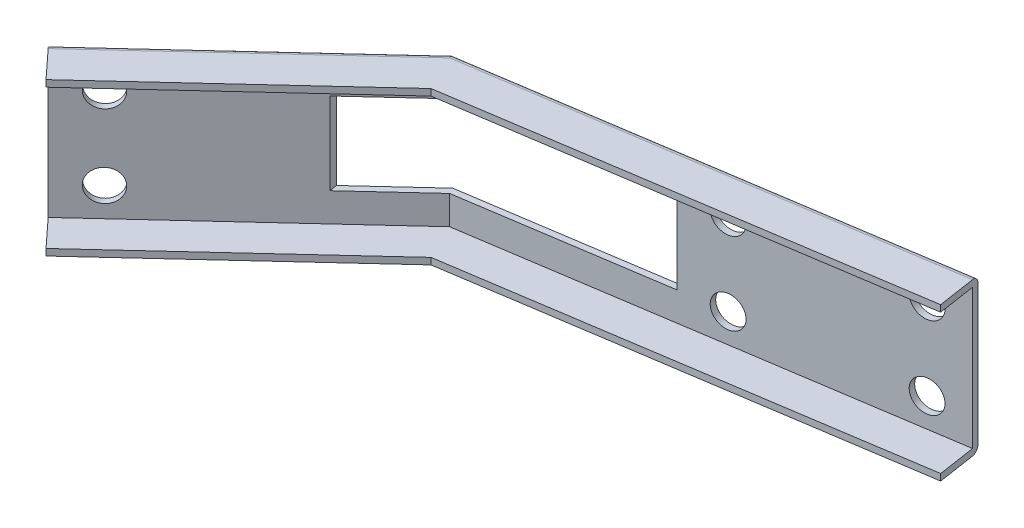
ISO-10303-21;
HEADER;
FILE_DESCRIPTION(('STEP AP214'),'2;1');
FILE_NAME('part.step','',(''),(''),'','','');
FILE_SCHEMA(('AUTOMOTIVE_DESIGN { 1 0 10303 214 1 1 1 1 }'));
ENDSEC;
DATA;
#1=APPLICATION_CONTEXT('core data for automotive mechanical design processes');
#2=APPLICATION_PROTOCOL_DEFINITION('international standard','automotive_design',2000,#1);
#3=PRODUCT_CONTEXT('',#1,'mechanical');
#4=PRODUCT('Part','Part','',(#3));
#5=PRODUCT_RELATED_PRODUCT_CATEGORY('part','',(#4));
#6=PRODUCT_DEFINITION_FORMATION('','',#4);
#7=PRODUCT_DEFINITION_CONTEXT('part definition',#1,'design');
#8=PRODUCT_DEFINITION('design','',#6,#7);
#9=PRODUCT_DEFINITION_SHAPE('','',#8);
#10=(LENGTH_UNIT() NAMED_UNIT(*) SI_UNIT(.MILLI.,.METRE.));
#11=(NAMED_UNIT(*) PLANE_ANGLE_UNIT() SI_UNIT($,.RADIAN.));
#12=(NAMED_UNIT(*) SI_UNIT($,.STERADIAN.) SOLID_ANGLE_UNIT());
#13=UNCERTAINTY_MEASURE_WITH_UNIT(LENGTH_MEASURE(1.E-05),#10,'distance_accuracy_value','');
#14=(GEOMETRIC_REPRESENTATION_CONTEXT(3) GLOBAL_UNCERTAINTY_ASSIGNED_CONTEXT((#13)) GLOBAL_UNIT_ASSIGNED_CONTEXT((#10,
#11,#12)) REPRESENTATION_CONTEXT('',''));
#15=CARTESIAN_POINT('',(0.,0.,0.));
#16=DIRECTION('',(0.,0.,1.));
#17=DIRECTION('',(1.,0.,0.));
#18=AXIS2_PLACEMENT_3D('',#15,#16,#17);
#19=CARTESIAN_POINT('',(83.2680733172753,26.64,-21.8416647390503));
#20=DIRECTION('',(0.1512877167966,0.,0.98848977068378));
#21=DIRECTION('',(0.98848977068378,0.,-0.1512877167966));
#22=AXIS2_PLACEMENT_3D('',#19,#20,#21);
#23=PLANE('',#22);
#24=CARTESIAN_POINT('',(76.9911632734333,5.5,-20.8809877373919));
#25=DIRECTION('',(-0.1512877167966,0.,-0.98848977068378));
#26=DIRECTION('',(-0.98848977068378,0.,0.1512877167966));
#27=AXIS2_PLACEMENT_3D('',#24,#25,#26);
#28=CIRCLE('',#27,3.00000000000001);
#29=CARTESIAN_POINT('',(74.025693961382,5.5,-20.4271245870021));
#30=VERTEX_POINT('',#29);
#31=EDGE_CURVE('E293',#30,#30,#28,.T.);
#32=ORIENTED_EDGE('',*,*,#31,.F.);
#33=EDGE_LOOP('',(#32));
#34=FACE_BOUND('',#33,.T.);
#35=CARTESIAN_POINT('',(44.0744539096634,5.5,-15.8431067680651));
#36=DIRECTION('',(-0.1512877167966,0.,-0.98848977068378));
#37=DIRECTION('',(-0.98848977068378,0.,0.1512877167966));
#38=AXIS2_PLACEMENT_3D('',#35,#36,#37);
#39=CIRCLE('',#38,3.);
#40=CARTESIAN_POINT('',(41.1089845976121,5.5,-15.3892436176753));
#41=VERTEX_POINT('',#40);
#42=EDGE_CURVE('E304',#41,#41,#39,.T.);
#43=ORIENTED_EDGE('',*,*,#42,.F.);
#44=EDGE_LOOP('',(#43));
#45=FACE_BOUND('',#44,.T.);
#46=CARTESIAN_POINT('',(44.0744539096634,21.14,-15.8431067680651));
#47=DIRECTION('',(-0.1512877167966,0.,-0.98848977068378));
#48=DIRECTION('',(-0.98848977068378,0.,0.1512877167966));
#49=AXIS2_PLACEMENT_3D('',#46,#47,#48);
#50=CIRCLE('',#49,3.);
#51=CARTESIAN_POINT('',(41.1089845976121,21.14,-15.3892436176753));
#52=VERTEX_POINT('',#51);
#53=EDGE_CURVE('E298',#52,#52,#50,.T.);
#54=ORIENTED_EDGE('',*,*,#53,.F.);
#55=EDGE_LOOP('',(#54));
#56=FACE_BOUND('',#55,.T.);
#57=CARTESIAN_POINT('',(76.9911632734333,21.14,-20.8809877373919));
#58=DIRECTION('',(-0.1512877167966,0.,-0.98848977068378));
#59=DIRECTION('',(-0.98848977068378,0.,0.1512877167966));
#60=AXIS2_PLACEMENT_3D('',#57,#58,#59);
#61=CIRCLE('',#60,3.00000000000001);
#62=CARTESIAN_POINT('',(74.025693961382,21.14,-20.4271245870021));
#63=VERTEX_POINT('',#62);
#64=EDGE_CURVE('E297',#63,#63,#61,.T.);
#65=ORIENTED_EDGE('',*,*,#64,.F.);
#66=EDGE_LOOP('',(#65));
#67=FACE_BOUND('',#66,.T.);
#68=DIRECTION('',(0.,-1.,0.));
#69=VECTOR('',#68,1.);
#70=CARTESIAN_POINT('',(-2.38309792909385,26.64,-8.73280866069736));
#71=LINE('',#70,#69);
#72=CARTESIAN_POINT('',(-2.38309792909385,5.5,-8.73280866069736));
#73=VERTEX_POINT('',#72);
#74=CARTESIAN_POINT('',(-2.38309792909385,0.,-8.73280866069736));
#75=VERTEX_POINT('',#74);
#76=EDGE_CURVE('E355',#73,#75,#71,.T.);
#77=ORIENTED_EDGE('',*,*,#76,.F.);
#78=DIRECTION('',(-0.98848977068378,0.,0.1512877167966));
#79=VECTOR('',#78,1.);
#80=CARTESIAN_POINT('',(35.6028924268988,5.5,-14.5465397903988));
#81=LINE('',#80,#79);
#82=CARTESIAN_POINT('',(35.6028924268988,5.5,-14.5465397903988));
#83=VERTEX_POINT('',#82);
#84=EDGE_CURVE('E199',#83,#73,#81,.T.);
#85=ORIENTED_EDGE('',*,*,#84,.F.);
#86=DIRECTION('',(0.,-1.,0.));
#87=VECTOR('',#86,1.);
#88=CARTESIAN_POINT('',(35.6028924268988,21.14,-14.5465397903988));
#89=LINE('',#88,#87);
#90=CARTESIAN_POINT('',(35.6028924268988,21.14,-14.5465397903988));
#91=VERTEX_POINT('',#90);
#92=EDGE_CURVE('E182',#91,#83,#89,.T.);
#93=ORIENTED_EDGE('',*,*,#92,.F.);
#94=DIRECTION('',(0.98848977068378,0.,-0.1512877167966));
#95=VECTOR('',#94,1.);
#96=CARTESIAN_POINT('',(35.6028924268988,21.14,-14.5465397903988));
#97=LINE('',#96,#95);
#98=CARTESIAN_POINT('',(-2.38309792909385,21.14,-8.73280866069736));
#99=VERTEX_POINT('',#98);
#100=EDGE_CURVE('E190',#99,#91,#97,.T.);
#101=ORIENTED_EDGE('',*,*,#100,.F.);
#102=CARTESIAN_POINT('',(-2.38309792909385,26.64,-8.73280866069736));
#103=VERTEX_POINT('',#102);
#104=EDGE_CURVE('E356',#103,#99,#71,.T.);
#105=ORIENTED_EDGE('',*,*,#104,.F.);
#106=DIRECTION('',(-0.98848977068378,0.,0.1512877167966));
#107=VECTOR('',#106,1.);
#108=CARTESIAN_POINT('',(83.2680733172753,26.64,-21.8416647390503));
#109=LINE('',#108,#107);
#110=CARTESIAN_POINT('',(84.5036855306301,26.64,-22.030774385046));
#111=VERTEX_POINT('',#110);
#112=EDGE_CURVE('E362',#103,#111,#109,.F.);
#113=ORIENTED_EDGE('',*,*,#112,.T.);
#114=DIRECTION('',(0.,1.,0.));
#115=VECTOR('',#114,1.);
#116=CARTESIAN_POINT('',(84.5036855306301,0.,-22.030774385046));
#117=LINE('',#116,#115);
#118=CARTESIAN_POINT('',(84.5036855306301,0.,-22.030774385046));
#119=VERTEX_POINT('',#118);
#120=EDGE_CURVE('E272',#119,#111,#117,.T.);
#121=ORIENTED_EDGE('',*,*,#120,.F.);
#122=DIRECTION('',(0.98848977068378,0.,-0.1512877167966));
#123=VECTOR('',#122,1.);
#124=CARTESIAN_POINT('',(-2.38309792909385,0.,-8.73280866069736));
#125=LINE('',#124,#123);
#126=EDGE_CURVE('E364',#119,#75,#125,.F.);
#127=ORIENTED_EDGE('',*,*,#126,.T.);
#128=EDGE_LOOP('',(#77,#85,#93,#101,#105,#113,#121,#127));
#129=FACE_BOUND('',#128,.T.);
#130=ADVANCED_FACE('F38',(#34,#45,#56,#67,#129),#23,.F.);
#131=CARTESIAN_POINT('',(-41.5646788234609,26.64,27.4248875475564));
#132=DIRECTION('',(0.678179666410242,0.,0.734896142368222));
#133=DIRECTION('',(0.734896142368222,0.,-0.678179666410242));
#134=AXIS2_PLACEMENT_3D('',#131,#132,#133);
#135=PLANE('',#134);
#136=CARTESIAN_POINT('',(-36.8980883194227,5.5,23.1184466658513));
#137=DIRECTION('',(-0.678179666410242,0.,-0.734896142368222));
#138=DIRECTION('',(-0.734896142368222,0.,0.678179666410242));
#139=AXIS2_PLACEMENT_3D('',#136,#137,#138);
#140=CIRCLE('',#139,3.);
#141=CARTESIAN_POINT('',(-39.1027767465273,5.5,25.152985665082));
#142=VERTEX_POINT('',#141);
#143=EDGE_CURVE('E256',#142,#142,#140,.T.);
#144=ORIENTED_EDGE('',*,*,#143,.F.);
#145=EDGE_LOOP('',(#144));
#146=FACE_BOUND('',#145,.T.);
#147=CARTESIAN_POINT('',(-36.8980883194227,21.14,23.1184466658513));
#148=DIRECTION('',(-0.678179666410242,0.,-0.734896142368222));
#149=DIRECTION('',(-0.734896142368222,0.,0.678179666410242));
#150=AXIS2_PLACEMENT_3D('',#147,#148,#149);
#151=CIRCLE('',#150,3.00000000000001);
#152=CARTESIAN_POINT('',(-39.1027767465273,21.14,25.1529856650821));
#153=VERTEX_POINT('',#152);
#154=EDGE_CURVE('E251',#153,#153,#151,.T.);
#155=ORIENTED_EDGE('',*,*,#154,.F.);
#156=EDGE_LOOP('',(#155));
#157=FACE_BOUND('',#156,.T.);
#158=DIRECTION('',(0.,-1.,0.));
#159=VECTOR('',#158,1.);
#160=CARTESIAN_POINT('',(-13.9180157054169,26.64,1.91188824083665));
#161=LINE('',#160,#159);
#162=CARTESIAN_POINT('',(-13.9180157054169,21.14,1.91188824083666));
#163=VERTEX_POINT('',#162);
#164=CARTESIAN_POINT('',(-13.9180157054169,5.5,1.91188824083666));
#165=VERTEX_POINT('',#164);
#166=EDGE_CURVE('E218',#163,#165,#161,.T.);
#167=ORIENTED_EDGE('',*,*,#166,.T.);
#168=DIRECTION('',(0.734896142368222,0.,-0.678179666410242));
#169=VECTOR('',#168,1.);
#170=CARTESIAN_POINT('',(-41.5646788234609,5.5,27.4248875475564));
#171=LINE('',#170,#169);
#172=EDGE_CURVE('E215',#165,#73,#171,.T.);
#173=ORIENTED_EDGE('',*,*,#172,.T.);
#174=ORIENTED_EDGE('',*,*,#76,.T.);
#175=DIRECTION('',(0.734896142368222,0.,-0.678179666410242));
#176=VECTOR('',#175,1.);
#177=CARTESIAN_POINT('',(-41.5646788234609,0.,27.4248875475564));
#178=LINE('',#177,#176);
#179=CARTESIAN_POINT('',(-42.4832990014212,0.,28.2726121305692));
#180=VERTEX_POINT('',#179);
#181=EDGE_CURVE('E369',#75,#180,#178,.F.);
#182=ORIENTED_EDGE('',*,*,#181,.T.);
#183=DIRECTION('',(0.,-1.,0.));
#184=VECTOR('',#183,1.);
#185=CARTESIAN_POINT('',(-42.4832990014212,26.64,28.2726121305692));
#186=LINE('',#185,#184);
#187=CARTESIAN_POINT('',(-42.4832990014212,26.64,28.2726121305692));
#188=VERTEX_POINT('',#187);
#189=EDGE_CURVE('E224',#188,#180,#186,.T.);
#190=ORIENTED_EDGE('',*,*,#189,.F.);
#191=DIRECTION('',(-0.734896142368222,0.,0.678179666410242));
#192=VECTOR('',#191,1.);
#193=CARTESIAN_POINT('',(-2.38309792909385,26.64,-8.73280866069735));
#194=LINE('',#193,#192);
#195=EDGE_CURVE('E367',#188,#103,#194,.F.);
#196=ORIENTED_EDGE('',*,*,#195,.T.);
#197=ORIENTED_EDGE('',*,*,#104,.T.);
#198=DIRECTION('',(-0.734896142368222,0.,0.678179666410242));
#199=VECTOR('',#198,1.);
#200=CARTESIAN_POINT('',(-41.5646788234609,21.14,27.4248875475564));
#201=LINE('',#200,#199);
#202=EDGE_CURVE('E193',#99,#163,#201,.T.);
#203=ORIENTED_EDGE('',*,*,#202,.T.);
#204=EDGE_LOOP('',(#167,#173,#174,#182,#190,#196,#197,#203));
#205=FACE_BOUND('',#204,.T.);
#206=ADVANCED_FACE('F425',(#146,#157,#205),#135,.F.);
#207=CARTESIAN_POINT('',(-40.7169542404481,26.64,28.3435077255166));
#208=DIRECTION('',(-0.678179666410242,0.,-0.734896142368222));
#209=DIRECTION('',(-0.734896142368222,0.,0.678179666410242));
#210=AXIS2_PLACEMENT_3D('',#207,#208,#209);
#211=PLANE('',#210);
#212=CARTESIAN_POINT('',(-36.0503637364099,5.5,24.0370668438116));
#213=DIRECTION('',(-0.678179666410242,0.,-0.734896142368222));
#214=DIRECTION('',(-0.734896142368222,0.,0.678179666410242));
#215=AXIS2_PLACEMENT_3D('',#212,#213,#214);
#216=CIRCLE('',#215,3.);
#217=CARTESIAN_POINT('',(-38.2550521635145,5.5,26.0716058430423));
#218=VERTEX_POINT('',#217);
#219=EDGE_CURVE('E252',#218,#218,#216,.T.);
#220=ORIENTED_EDGE('',*,*,#219,.T.);
#221=EDGE_LOOP('',(#220));
#222=FACE_BOUND('',#221,.T.);
#223=CARTESIAN_POINT('',(-36.0503637364099,21.14,24.0370668438116));
#224=DIRECTION('',(-0.678179666410242,0.,-0.734896142368222));
#225=DIRECTION('',(-0.734896142368222,0.,0.678179666410242));
#226=AXIS2_PLACEMENT_3D('',#223,#224,#225);
#227=CIRCLE('',#226,3.00000000000001);
#228=CARTESIAN_POINT('',(-38.2550521635145,21.14,26.0716058430423));
#229=VERTEX_POINT('',#228);
#230=EDGE_CURVE('E259',#229,#229,#227,.T.);
#231=ORIENTED_EDGE('',*,*,#230,.T.);
#232=EDGE_LOOP('',(#231));
#233=FACE_BOUND('',#232,.T.);
#234=DIRECTION('',(0.,-1.,0.));
#235=VECTOR('',#234,1.);
#236=CARTESIAN_POINT('',(-1.81622371909089,26.64,-7.55501306828298));
#237=LINE('',#236,#235);
#238=CARTESIAN_POINT('',(-1.8162237190909,5.5,-7.55501306828298));
#239=VERTEX_POINT('',#238);
#240=CARTESIAN_POINT('',(-1.81622371909089,0.,-7.55501306828298));
#241=VERTEX_POINT('',#240);
#242=EDGE_CURVE('E348',#239,#241,#237,.T.);
#243=ORIENTED_EDGE('',*,*,#242,.F.);
#244=DIRECTION('',(-0.734896142368222,0.,0.678179666410242));
#245=VECTOR('',#244,1.);
#246=CARTESIAN_POINT('',(-40.7169542404481,5.5,28.3435077255166));
#247=LINE('',#246,#245);
#248=CARTESIAN_POINT('',(-13.6899082561816,5.5,3.40230586997574));
#249=VERTEX_POINT('',#248);
#250=EDGE_CURVE('E212',#239,#249,#247,.T.);
#251=ORIENTED_EDGE('',*,*,#250,.T.);
#252=DIRECTION('',(0.,1.,0.));
#253=VECTOR('',#252,1.);
#254=CARTESIAN_POINT('',(-13.6899082561816,26.64,3.40230586997575));
#255=LINE('',#254,#253);
#256=CARTESIAN_POINT('',(-13.6899082561816,21.14,3.40230586997574));
#257=VERTEX_POINT('',#256);
#258=EDGE_CURVE('E11',#249,#257,#255,.T.);
#259=ORIENTED_EDGE('',*,*,#258,.T.);
#260=DIRECTION('',(0.734896142368222,0.,-0.678179666410242));
#261=VECTOR('',#260,1.);
#262=CARTESIAN_POINT('',(-40.7169542404481,21.14,28.3435077255166));
#263=LINE('',#262,#261);
#264=CARTESIAN_POINT('',(-1.8162237190909,21.14,-7.55501306828298));
#265=VERTEX_POINT('',#264);
#266=EDGE_CURVE('E206',#257,#265,#263,.T.);
#267=ORIENTED_EDGE('',*,*,#266,.T.);
#268=CARTESIAN_POINT('',(-1.81622371909089,26.64,-7.55501306828298));
#269=VERTEX_POINT('',#268);
#270=EDGE_CURVE('E352',#269,#265,#237,.T.);
#271=ORIENTED_EDGE('',*,*,#270,.F.);
#272=DIRECTION('',(0.734896142368221,0.,-0.678179666410242));
#273=VECTOR('',#272,1.);
#274=CARTESIAN_POINT('',(-40.7169542404481,26.64,28.3435077255166));
#275=LINE('',#274,#273);
#276=CARTESIAN_POINT('',(-41.6355744184084,26.64,29.1912323085294));
#277=VERTEX_POINT('',#276);
#278=EDGE_CURVE('E342',#277,#269,#275,.T.);
#279=ORIENTED_EDGE('',*,*,#278,.F.);
#280=DIRECTION('',(0.,1.,0.));
#281=VECTOR('',#280,1.);
#282=CARTESIAN_POINT('',(-41.6355744184084,0.,29.1912323085294));
#283=LINE('',#282,#281);
#284=CARTESIAN_POINT('',(-41.6355744184084,0.,29.1912323085294));
#285=VERTEX_POINT('',#284);
#286=EDGE_CURVE('E239',#285,#277,#283,.T.);
#287=ORIENTED_EDGE('',*,*,#286,.F.);
#288=DIRECTION('',(0.734896142368221,0.,-0.678179666410242));
#289=VECTOR('',#288,1.);
#290=CARTESIAN_POINT('',(-40.7169542404481,0.,28.3435077255166));
#291=LINE('',#290,#289);
#292=EDGE_CURVE('E341',#285,#241,#291,.T.);
#293=ORIENTED_EDGE('',*,*,#292,.T.);
#294=EDGE_LOOP('',(#243,#251,#259,#267,#271,#279,#287,#293));
#295=FACE_BOUND('',#294,.T.);
#296=ADVANCED_FACE('F388',(#222,#233,#295),#211,.F.);
#297=CARTESIAN_POINT('',(83.4571829632711,26.64,-20.6060525256953));
#298=DIRECTION('',(-0.1512877167966,0.,-0.98848977068378));
#299=DIRECTION('',(-0.98848977068378,0.,0.1512877167966));
#300=AXIS2_PLACEMENT_3D('',#297,#298,#299);
#301=PLANE('',#300);
#302=CARTESIAN_POINT('',(77.1802729194291,5.5,-19.6453755240371));
#303=DIRECTION('',(-0.1512877167966,0.,-0.98848977068378));
#304=DIRECTION('',(-0.98848977068378,0.,0.1512877167966));
#305=AXIS2_PLACEMENT_3D('',#302,#303,#304);
#306=CIRCLE('',#305,3.00000000000001);
#307=CARTESIAN_POINT('',(74.2148036073777,5.5,-19.1915123736473));
#308=VERTEX_POINT('',#307);
#309=EDGE_CURVE('E307',#308,#308,#306,.T.);
#310=ORIENTED_EDGE('',*,*,#309,.T.);
#311=EDGE_LOOP('',(#310));
#312=FACE_BOUND('',#311,.T.);
#313=CARTESIAN_POINT('',(44.2635635556592,5.5,-14.6074945547104));
#314=DIRECTION('',(-0.1512877167966,0.,-0.98848977068378));
#315=DIRECTION('',(-0.98848977068378,0.,0.1512877167966));
#316=AXIS2_PLACEMENT_3D('',#313,#314,#315);
#317=CIRCLE('',#316,3.);
#318=CARTESIAN_POINT('',(41.2980942436078,5.5,-14.1536314043206));
#319=VERTEX_POINT('',#318);
#320=EDGE_CURVE('E301',#319,#319,#317,.T.);
#321=ORIENTED_EDGE('',*,*,#320,.T.);
#322=EDGE_LOOP('',(#321));
#323=FACE_BOUND('',#322,.T.);
#324=CARTESIAN_POINT('',(44.2635635556592,21.14,-14.6074945547104));
#325=DIRECTION('',(-0.1512877167966,0.,-0.98848977068378));
#326=DIRECTION('',(-0.98848977068378,0.,0.1512877167966));
#327=AXIS2_PLACEMENT_3D('',#324,#325,#326);
#328=CIRCLE('',#327,3.);
#329=CARTESIAN_POINT('',(41.2980942436078,21.14,-14.1536314043206));
#330=VERTEX_POINT('',#329);
#331=EDGE_CURVE('E294',#330,#330,#328,.T.);
#332=ORIENTED_EDGE('',*,*,#331,.T.);
#333=EDGE_LOOP('',(#332));
#334=FACE_BOUND('',#333,.T.);
#335=CARTESIAN_POINT('',(77.1802729194291,21.14,-19.6453755240371));
#336=DIRECTION('',(-0.1512877167966,0.,-0.98848977068378));
#337=DIRECTION('',(-0.98848977068378,0.,0.1512877167966));
#338=AXIS2_PLACEMENT_3D('',#335,#336,#337);
#339=CIRCLE('',#338,3.00000000000001);
#340=CARTESIAN_POINT('',(74.2148036073777,21.14,-19.1915123736473));
#341=VERTEX_POINT('',#340);
#342=EDGE_CURVE('E312',#341,#341,#339,.T.);
#343=ORIENTED_EDGE('',*,*,#342,.T.);
#344=EDGE_LOOP('',(#343));
#345=FACE_BOUND('',#344,.T.);
#346=DIRECTION('',(0.,-1.,0.));
#347=VECTOR('',#346,1.);
#348=CARTESIAN_POINT('',(35.7920020728945,26.64,-13.3109275770439));
#349=LINE('',#348,#347);
#350=CARTESIAN_POINT('',(35.7920020728945,21.14,-13.3109275770439));
#351=VERTEX_POINT('',#350);
#352=CARTESIAN_POINT('',(35.7920020728945,5.5,-13.3109275770439));
#353=VERTEX_POINT('',#352);
#354=EDGE_CURVE('E185',#351,#353,#349,.T.);
#355=ORIENTED_EDGE('',*,*,#354,.T.);
#356=DIRECTION('',(-0.98848977068378,0.,0.1512877167966));
#357=VECTOR('',#356,1.);
#358=CARTESIAN_POINT('',(83.4571829632711,5.5,-20.6060525256953));
#359=LINE('',#358,#357);
#360=EDGE_CURVE('E46',#353,#239,#359,.T.);
#361=ORIENTED_EDGE('',*,*,#360,.T.);
#362=ORIENTED_EDGE('',*,*,#242,.T.);
#363=DIRECTION('',(0.98848977068378,0.,-0.1512877167966));
#364=VECTOR('',#363,1.);
#365=CARTESIAN_POINT('',(83.4571829632711,0.,-20.6060525256953));
#366=LINE('',#365,#364);
#367=CARTESIAN_POINT('',(84.6927951766259,0.,-20.7951621716911));
#368=VERTEX_POINT('',#367);
#369=EDGE_CURVE('E346',#241,#368,#366,.T.);
#370=ORIENTED_EDGE('',*,*,#369,.T.);
#371=DIRECTION('',(0.,-1.,0.));
#372=VECTOR('',#371,1.);
#373=CARTESIAN_POINT('',(84.6927951766259,26.64,-20.7951621716911));
#374=LINE('',#373,#372);
#375=CARTESIAN_POINT('',(84.6927951766259,26.64,-20.7951621716911));
#376=VERTEX_POINT('',#375);
#377=EDGE_CURVE('E287',#376,#368,#374,.T.);
#378=ORIENTED_EDGE('',*,*,#377,.F.);
#379=DIRECTION('',(0.98848977068378,0.,-0.1512877167966));
#380=VECTOR('',#379,1.);
#381=CARTESIAN_POINT('',(83.4571829632711,26.64,-20.6060525256953));
#382=LINE('',#381,#380);
#383=EDGE_CURVE('E345',#269,#376,#382,.T.);
#384=ORIENTED_EDGE('',*,*,#383,.F.);
#385=ORIENTED_EDGE('',*,*,#270,.T.);
#386=DIRECTION('',(0.98848977068378,0.,-0.1512877167966));
#387=VECTOR('',#386,1.);
#388=CARTESIAN_POINT('',(83.4571829632711,21.14,-20.6060525256953));
#389=LINE('',#388,#387);
#390=EDGE_CURVE('E376',#265,#351,#389,.T.);
#391=ORIENTED_EDGE('',*,*,#390,.T.);
#392=EDGE_LOOP('',(#355,#361,#362,#370,#378,#384,#385,#391));
#393=FACE_BOUND('',#392,.T.);
#394=ADVANCED_FACE('F384',(#312,#323,#334,#345,#393),#301,.F.);
#395=CARTESIAN_POINT('',(0.,26.64,0.));
#396=DIRECTION('',(0.,1.,0.));
#397=DIRECTION('',(0.,0.,1.));
#398=AXIS2_PLACEMENT_3D('',#395,#396,#397);
#399=PLANE('',#398);
#400=DIRECTION('',(0.734896142368221,0.,-0.678179666410242));
#401=VECTOR('',#400,1.);
#402=CARTESIAN_POINT('',(-35.8001516589738,26.64,33.6715047576862));
#403=LINE('',#402,#401);
#404=CARTESIAN_POINT('',(-36.7187718369341,26.64,34.519229340699));
#405=VERTEX_POINT('',#404);
#406=CARTESIAN_POINT('',(1.47164669892874,26.64,-0.723798632281867));
#407=VERTEX_POINT('',#406);
#408=EDGE_CURVE('E330',#405,#407,#403,.T.);
#409=ORIENTED_EDGE('',*,*,#408,.F.);
#410=DIRECTION('',(0.678179666410242,0.,0.734896142368221));
#411=VECTOR('',#410,1.);
#412=CARTESIAN_POINT('',(-41.6355744184084,26.64,29.1912323085294));
#413=LINE('',#412,#411);
#414=EDGE_CURVE('E242',#277,#405,#413,.T.);
#415=ORIENTED_EDGE('',*,*,#414,.F.);
#416=ORIENTED_EDGE('',*,*,#278,.T.);
#417=ORIENTED_EDGE('',*,*,#383,.T.);
#418=DIRECTION('',(-0.151287716796602,0.,-0.98848977068378));
#419=VECTOR('',#418,1.);
#420=CARTESIAN_POINT('',(85.7896311234012,26.64,-13.6286113342339));
#421=LINE('',#420,#419);
#422=CARTESIAN_POINT('',(85.7896311234012,26.64,-13.6286113342339));
#423=VERTEX_POINT('',#422);
#424=EDGE_CURVE('E284',#423,#376,#421,.T.);
#425=ORIENTED_EDGE('',*,*,#424,.F.);
#426=DIRECTION('',(0.98848977068378,0.,-0.1512877167966));
#427=VECTOR('',#426,1.);
#428=CARTESIAN_POINT('',(84.5540189100464,26.64,-13.4395016882382));
#429=LINE('',#428,#427);
#430=EDGE_CURVE('E334',#407,#423,#429,.T.);
#431=ORIENTED_EDGE('',*,*,#430,.F.);
#432=EDGE_LOOP('',(#409,#415,#416,#417,#425,#431));
#433=FACE_BOUND('',#432,.T.);
#434=ADVANCED_FACE('F446',(#433),#399,.F.);
#435=CARTESIAN_POINT('',(-35.8001516589738,27.89,33.6715047576862));
#436=DIRECTION('',(-0.678179666410242,0.,-0.734896142368221));
#437=DIRECTION('',(-0.734896142368221,0.,0.678179666410242));
#438=AXIS2_PLACEMENT_3D('',#435,#436,#437);
#439=PLANE('',#438);
#440=ORIENTED_EDGE('',*,*,#408,.T.);
#441=DIRECTION('',(0.,-1.,0.));
#442=VECTOR('',#441,1.);
#443=CARTESIAN_POINT('',(1.47164669892874,27.89,-0.723798632281867));
#444=LINE('',#443,#442);
#445=CARTESIAN_POINT('',(1.47164669892874,27.89,-0.723798632281867));
#446=VERTEX_POINT('',#445);
#447=EDGE_CURVE('E336',#446,#407,#444,.T.);
#448=ORIENTED_EDGE('',*,*,#447,.F.);
#449=DIRECTION('',(0.734896142368221,0.,-0.678179666410242));
#450=VECTOR('',#449,1.);
#451=CARTESIAN_POINT('',(-35.8001516589738,27.89,33.6715047576862));
#452=LINE('',#451,#450);
#453=CARTESIAN_POINT('',(-36.7187718369341,27.89,34.519229340699));
#454=VERTEX_POINT('',#453);
#455=EDGE_CURVE('E331',#454,#446,#452,.T.);
#456=ORIENTED_EDGE('',*,*,#455,.F.);
#457=DIRECTION('',(0.,1.,0.));
#458=VECTOR('',#457,1.);
#459=CARTESIAN_POINT('',(-36.7187718369341,26.64,34.519229340699));
#460=LINE('',#459,#458);
#461=EDGE_CURVE('E245',#405,#454,#460,.T.);
#462=ORIENTED_EDGE('',*,*,#461,.F.);
#463=EDGE_LOOP('',(#440,#448,#456,#462));
#464=FACE_BOUND('',#463,.T.);
#465=ADVANCED_FACE('F532',(#464),#439,.F.);
#466=CARTESIAN_POINT('',(84.5540189100464,27.89,-13.4395016882382));
#467=DIRECTION('',(-0.1512877167966,0.,-0.98848977068378));
#468=DIRECTION('',(-0.98848977068378,0.,0.1512877167966));
#469=AXIS2_PLACEMENT_3D('',#466,#467,#468);
#470=PLANE('',#469);
#471=ORIENTED_EDGE('',*,*,#430,.T.);
#472=DIRECTION('',(0.,-1.,0.));
#473=VECTOR('',#472,1.);
#474=CARTESIAN_POINT('',(85.7896311234012,27.89,-13.6286113342339));
#475=LINE('',#474,#473);
#476=CARTESIAN_POINT('',(85.7896311234012,27.89,-13.6286113342339));
#477=VERTEX_POINT('',#476);
#478=EDGE_CURVE('E281',#477,#423,#475,.T.);
#479=ORIENTED_EDGE('',*,*,#478,.F.);
#480=DIRECTION('',(0.98848977068378,0.,-0.1512877167966));
#481=VECTOR('',#480,1.);
#482=CARTESIAN_POINT('',(84.5540189100464,27.89,-13.4395016882382));
#483=LINE('',#482,#481);
#484=EDGE_CURVE('E333',#446,#477,#483,.T.);
#485=ORIENTED_EDGE('',*,*,#484,.F.);
#486=ORIENTED_EDGE('',*,*,#447,.T.);
#487=EDGE_LOOP('',(#471,#479,#485,#486));
#488=FACE_BOUND('',#487,.T.);
#489=ADVANCED_FACE('F442',(#488),#470,.F.);
#490=CARTESIAN_POINT('',(0.,27.89,0.));
#491=DIRECTION('',(0.,1.,0.));
#492=DIRECTION('',(0.,0.,1.));
#493=AXIS2_PLACEMENT_3D('',#490,#491,#492);
#494=PLANE('',#493);
#495=ORIENTED_EDGE('',*,*,#484,.T.);
#496=DIRECTION('',(0.151287716796603,0.,0.98848977068378));
#497=VECTOR('',#496,1.);
#498=CARTESIAN_POINT('',(84.6927951766259,27.89,-20.7951621716913));
#499=LINE('',#498,#497);
#500=CARTESIAN_POINT('',(84.6927951766259,27.89,-20.7951621716913));
#501=VERTEX_POINT('',#500);
#502=EDGE_CURVE('E278',#501,#477,#499,.T.);
#503=ORIENTED_EDGE('',*,*,#502,.F.);
#504=DIRECTION('',(-0.98848977068378,0.,0.1512877167966));
#505=VECTOR('',#504,1.);
#506=CARTESIAN_POINT('',(-2.1939882830981,27.89,-7.49719644734263));
#507=LINE('',#506,#505);
#508=CARTESIAN_POINT('',(-1.81622371909052,27.89,-7.55501306828331));
#509=VERTEX_POINT('',#508);
#510=EDGE_CURVE('E373',#501,#509,#507,.T.);
#511=ORIENTED_EDGE('',*,*,#510,.T.);
#512=DIRECTION('',(-0.734896142368222,0.,0.678179666410242));
#513=VECTOR('',#512,1.);
#514=CARTESIAN_POINT('',(-40.7169542404481,27.89,28.3435077255166));
#515=LINE('',#514,#513);
#516=CARTESIAN_POINT('',(-41.6355744184084,27.89,29.1912323085294));
#517=VERTEX_POINT('',#516);
#518=EDGE_CURVE('E371',#509,#517,#515,.T.);
#519=ORIENTED_EDGE('',*,*,#518,.T.);
#520=DIRECTION('',(-0.678179666410242,0.,-0.734896142368221));
#521=VECTOR('',#520,1.);
#522=CARTESIAN_POINT('',(-36.7187718369341,27.89,34.519229340699));
#523=LINE('',#522,#521);
#524=EDGE_CURVE('E248',#454,#517,#523,.T.);
#525=ORIENTED_EDGE('',*,*,#524,.F.);
#526=ORIENTED_EDGE('',*,*,#455,.T.);
#527=EDGE_LOOP('',(#495,#503,#511,#519,#525,#526));
#528=FACE_BOUND('',#527,.T.);
#529=ADVANCED_FACE('F438',(#528),#494,.T.);
#530=CARTESIAN_POINT('',(84.5540189100464,-1.25,-13.4395016882382));
#531=DIRECTION('',(-0.1512877167966,0.,-0.98848977068378));
#532=DIRECTION('',(-0.98848977068378,0.,0.1512877167966));
#533=AXIS2_PLACEMENT_3D('',#530,#531,#532);
#534=PLANE('',#533);
#535=DIRECTION('',(-0.98848977068378,0.,0.1512877167966));
#536=VECTOR('',#535,1.);
#537=CARTESIAN_POINT('',(84.5540189100464,0.,-13.4395016882382));
#538=LINE('',#537,#536);
#539=CARTESIAN_POINT('',(85.7896311234012,0.,-13.6286113342339));
#540=VERTEX_POINT('',#539);
#541=CARTESIAN_POINT('',(1.47164669892874,0.,-0.723798632281867));
#542=VERTEX_POINT('',#541);
#543=EDGE_CURVE('E324',#540,#542,#538,.T.);
#544=ORIENTED_EDGE('',*,*,#543,.T.);
#545=DIRECTION('',(0.,1.,0.));
#546=VECTOR('',#545,1.);
#547=CARTESIAN_POINT('',(1.47164669892874,-1.25,-0.723798632281867));
#548=LINE('',#547,#546);
#549=CARTESIAN_POINT('',(1.47164669892874,-1.25,-0.723798632281867));
#550=VERTEX_POINT('',#549);
#551=EDGE_CURVE('E323',#550,#542,#548,.T.);
#552=ORIENTED_EDGE('',*,*,#551,.F.);
#553=DIRECTION('',(-0.98848977068378,0.,0.1512877167966));
#554=VECTOR('',#553,1.);
#555=CARTESIAN_POINT('',(84.5540189100464,-1.25,-13.4395016882382));
#556=LINE('',#555,#554);
#557=CARTESIAN_POINT('',(85.7896311234012,-1.25,-13.6286113342339));
#558=VERTEX_POINT('',#557);
#559=EDGE_CURVE('E318',#558,#550,#556,.T.);
#560=ORIENTED_EDGE('',*,*,#559,.F.);
#561=DIRECTION('',(0.,-1.,0.));
#562=VECTOR('',#561,1.);
#563=CARTESIAN_POINT('',(85.7896311234012,0.,-13.6286113342339));
#564=LINE('',#563,#562);
#565=EDGE_CURVE('E255',#540,#558,#564,.T.);
#566=ORIENTED_EDGE('',*,*,#565,.F.);
#567=EDGE_LOOP('',(#544,#552,#560,#566));
#568=FACE_BOUND('',#567,.T.);
#569=ADVANCED_FACE('F409',(#568),#534,.F.);
#570=CARTESIAN_POINT('',(1.47164669892874,-1.25,-0.723798632281867));
#571=DIRECTION('',(-0.678179666410242,0.,-0.734896142368221));
#572=DIRECTION('',(-0.734896142368221,0.,0.678179666410242));
#573=AXIS2_PLACEMENT_3D('',#570,#571,#572);
#574=PLANE('',#573);
#575=DIRECTION('',(-0.734896142368221,0.,0.678179666410242));
#576=VECTOR('',#575,1.);
#577=CARTESIAN_POINT('',(1.47164669892874,0.,-0.723798632281867));
#578=LINE('',#577,#576);
#579=CARTESIAN_POINT('',(-36.7187718369341,0.,34.519229340699));
#580=VERTEX_POINT('',#579);
#581=EDGE_CURVE('E321',#542,#580,#578,.T.);
#582=ORIENTED_EDGE('',*,*,#581,.T.);
#583=DIRECTION('',(0.,1.,0.));
#584=VECTOR('',#583,1.);
#585=CARTESIAN_POINT('',(-36.7187718369341,-1.25,34.519229340699));
#586=LINE('',#585,#584);
#587=CARTESIAN_POINT('',(-36.7187718369341,-1.25,34.519229340699));
#588=VERTEX_POINT('',#587);
#589=EDGE_CURVE('E233',#588,#580,#586,.T.);
#590=ORIENTED_EDGE('',*,*,#589,.F.);
#591=DIRECTION('',(-0.734896142368221,0.,0.678179666410242));
#592=VECTOR('',#591,1.);
#593=CARTESIAN_POINT('',(1.47164669892874,-1.25,-0.723798632281867));
#594=LINE('',#593,#592);
#595=EDGE_CURVE('E320',#550,#588,#594,.T.);
#596=ORIENTED_EDGE('',*,*,#595,.F.);
#597=ORIENTED_EDGE('',*,*,#551,.T.);
#598=EDGE_LOOP('',(#582,#590,#596,#597));
#599=FACE_BOUND('',#598,.T.);
#600=ADVANCED_FACE('F402',(#599),#574,.F.);
#601=CARTESIAN_POINT('',(0.,-1.25,0.));
#602=DIRECTION('',(0.,-1.,0.));
#603=DIRECTION('',(0.,0.,-1.));
#604=AXIS2_PLACEMENT_3D('',#601,#602,#603);
#605=PLANE('',#604);
#606=DIRECTION('',(0.734896142368222,0.,-0.678179666410242));
#607=VECTOR('',#606,1.);
#608=CARTESIAN_POINT('',(-1.53537334608105,-1.25,-7.81418848273708));
#609=LINE('',#608,#607);
#610=CARTESIAN_POINT('',(-41.6355744184084,-1.25,29.1912323085294));
#611=VERTEX_POINT('',#610);
#612=CARTESIAN_POINT('',(-1.81622371909052,-1.25,-7.55501306828332));
#613=VERTEX_POINT('',#612);
#614=EDGE_CURVE('E358',#611,#613,#609,.T.);
#615=ORIENTED_EDGE('',*,*,#614,.T.);
#616=DIRECTION('',(0.98848977068378,0.,-0.1512877167966));
#617=VECTOR('',#616,1.);
#618=CARTESIAN_POINT('',(83.4571829632711,-1.25,-20.6060525256956));
#619=LINE('',#618,#617);
#620=CARTESIAN_POINT('',(84.6927951766259,-1.25,-20.7951621716913));
#621=VERTEX_POINT('',#620);
#622=EDGE_CURVE('E360',#613,#621,#619,.T.);
#623=ORIENTED_EDGE('',*,*,#622,.T.);
#624=DIRECTION('',(-0.151287716796603,0.,-0.98848977068378));
#625=VECTOR('',#624,1.);
#626=CARTESIAN_POINT('',(85.7896311234012,-1.25,-13.6286113342339));
#627=LINE('',#626,#625);
#628=EDGE_CURVE('E266',#558,#621,#627,.T.);
#629=ORIENTED_EDGE('',*,*,#628,.F.);
#630=ORIENTED_EDGE('',*,*,#559,.T.);
#631=ORIENTED_EDGE('',*,*,#595,.T.);
#632=DIRECTION('',(0.678179666410242,0.,0.734896142368221));
#633=VECTOR('',#632,1.);
#634=CARTESIAN_POINT('',(-41.6355744184084,-1.25,29.1912323085294));
#635=LINE('',#634,#633);
#636=EDGE_CURVE('E230',#611,#588,#635,.T.);
#637=ORIENTED_EDGE('',*,*,#636,.F.);
#638=EDGE_LOOP('',(#615,#623,#629,#630,#631,#637));
#639=FACE_BOUND('',#638,.T.);
#640=ADVANCED_FACE('F412',(#639),#605,.T.);
#641=CARTESIAN_POINT('',(0.,0.,0.));
#642=DIRECTION('',(0.,-1.,0.));
#643=DIRECTION('',(0.,0.,-1.));
#644=AXIS2_PLACEMENT_3D('',#641,#642,#643);
#645=PLANE('',#644);
#646=ORIENTED_EDGE('',*,*,#369,.F.);
#647=ORIENTED_EDGE('',*,*,#292,.F.);
#648=DIRECTION('',(-0.678179666410242,0.,-0.734896142368221));
#649=VECTOR('',#648,1.);
#650=CARTESIAN_POINT('',(-36.7187718369341,0.,34.519229340699));
#651=LINE('',#650,#649);
#652=EDGE_CURVE('E236',#580,#285,#651,.T.);
#653=ORIENTED_EDGE('',*,*,#652,.F.);
#654=ORIENTED_EDGE('',*,*,#581,.F.);
#655=ORIENTED_EDGE('',*,*,#543,.F.);
#656=DIRECTION('',(0.151287716796602,0.,0.98848977068378));
#657=VECTOR('',#656,1.);
#658=CARTESIAN_POINT('',(84.6927951766259,0.,-20.7951621716911));
#659=LINE('',#658,#657);
#660=EDGE_CURVE('E290',#368,#540,#659,.T.);
#661=ORIENTED_EDGE('',*,*,#660,.F.);
#662=EDGE_LOOP('',(#646,#647,#653,#654,#655,#661));
#663=FACE_BOUND('',#662,.T.);
#664=ADVANCED_FACE('F392',(#663),#645,.F.);
#665=CARTESIAN_POINT('',(-4.60068673237592,0.,-4.98544426990013));
#666=DIRECTION('',(-0.734896142368222,0.,0.678179666410242));
#667=DIRECTION('',(0.678179666410242,0.,0.734896142368222));
#668=AXIS2_PLACEMENT_3D('',#665,#666,#667);
#669=CYLINDRICAL_SURFACE('',#668,1.25);
#670=ORIENTED_EDGE('',*,*,#614,.F.);
#671=CARTESIAN_POINT('',(-41.6355744184084,0.,29.1912323085294));
#672=DIRECTION('',(-0.734896142368222,0.,0.678179666410242));
#673=DIRECTION('',(0.678179666410242,0.,0.734896142368222));
#674=AXIS2_PLACEMENT_3D('',#671,#672,#673);
#675=CIRCLE('',#674,1.25);
#676=EDGE_CURVE('E227',#180,#611,#675,.T.);
#677=ORIENTED_EDGE('',*,*,#676,.F.);
#678=ORIENTED_EDGE('',*,*,#181,.F.);
#679=CARTESIAN_POINT('',(-1.81622371909052,0.,-7.55501306828331));
#680=DIRECTION('',(-0.901065221262277,0.,0.43368360244718));
#681=DIRECTION('',(0.43368360244718,0.,0.901065221262277));
#682=AXIS2_PLACEMENT_3D('',#679,#680,#681);
#683=ELLIPSE('',#682,1.30711469560893,1.25);
#684=EDGE_CURVE('E326',#613,#75,#683,.F.);
#685=ORIENTED_EDGE('',*,*,#684,.F.);
#686=EDGE_LOOP('',(#670,#677,#678,#685));
#687=FACE_BOUND('',#686,.T.);
#688=ADVANCED_FACE('F422',(#687),#669,.T.);
#689=CARTESIAN_POINT('',(-1.17139438767235,0.,-7.65370377826026));
#690=DIRECTION('',(-0.98848977068378,0.,0.1512877167966));
#691=DIRECTION('',(0.1512877167966,0.,0.98848977068378));
#692=AXIS2_PLACEMENT_3D('',#689,#690,#691);
#693=CYLINDRICAL_SURFACE('',#692,1.25);
#694=ORIENTED_EDGE('',*,*,#684,.T.);
#695=ORIENTED_EDGE('',*,*,#126,.F.);
#696=CARTESIAN_POINT('',(84.6927951766259,0.,-20.7951621716913));
#697=DIRECTION('',(0.98848977068378,0.,-0.151287716796603));
#698=DIRECTION('',(-0.151287716796603,0.,-0.98848977068378));
#699=AXIS2_PLACEMENT_3D('',#696,#697,#698);
#700=CIRCLE('',#699,1.25);
#701=EDGE_CURVE('E269',#621,#119,#700,.T.);
#702=ORIENTED_EDGE('',*,*,#701,.F.);
#703=ORIENTED_EDGE('',*,*,#622,.F.);
#704=EDGE_LOOP('',(#694,#695,#702,#703));
#705=FACE_BOUND('',#704,.T.);
#706=ADVANCED_FACE('F417',(#705),#693,.T.);
#707=CARTESIAN_POINT('',(-4.60068673237592,26.64,-4.98544426990013));
#708=DIRECTION('',(0.734896142368222,0.,-0.678179666410242));
#709=DIRECTION('',(-0.678179666410242,0.,-0.734896142368222));
#710=AXIS2_PLACEMENT_3D('',#707,#708,#709);
#711=CYLINDRICAL_SURFACE('',#710,1.25);
#712=ORIENTED_EDGE('',*,*,#195,.F.);
#713=CARTESIAN_POINT('',(-41.6355744184084,26.64,29.1912323085294));
#714=DIRECTION('',(-0.734896142368222,0.,0.678179666410242));
#715=DIRECTION('',(0.678179666410242,0.,0.734896142368222));
#716=AXIS2_PLACEMENT_3D('',#713,#714,#715);
#717=CIRCLE('',#716,1.25);
#718=EDGE_CURVE('E221',#517,#188,#717,.T.);
#719=ORIENTED_EDGE('',*,*,#718,.F.);
#720=ORIENTED_EDGE('',*,*,#518,.F.);
#721=CARTESIAN_POINT('',(-1.81622371909052,26.64,-7.55501306828331));
#722=DIRECTION('',(0.901065221262277,0.,-0.43368360244718));
#723=DIRECTION('',(-0.43368360244718,0.,-0.901065221262277));
#724=AXIS2_PLACEMENT_3D('',#721,#722,#723);
#725=ELLIPSE('',#724,1.30711469560893,1.25);
#726=EDGE_CURVE('E315',#103,#509,#725,.T.);
#727=ORIENTED_EDGE('',*,*,#726,.F.);
#728=EDGE_LOOP('',(#712,#719,#720,#727));
#729=FACE_BOUND('',#728,.T.);
#730=ADVANCED_FACE('F40',(#729),#711,.T.);
#731=CARTESIAN_POINT('',(-1.17139438767235,26.64,-7.65370377826026));
#732=DIRECTION('',(0.98848977068378,0.,-0.1512877167966));
#733=DIRECTION('',(-0.1512877167966,0.,-0.98848977068378));
#734=AXIS2_PLACEMENT_3D('',#731,#732,#733);
#735=CYLINDRICAL_SURFACE('',#734,1.25);
#736=ORIENTED_EDGE('',*,*,#510,.F.);
#737=CARTESIAN_POINT('',(84.6927951766259,26.64,-20.7951621716913));
#738=DIRECTION('',(0.98848977068378,0.,-0.151287716796603));
#739=DIRECTION('',(-0.151287716796603,0.,-0.98848977068378));
#740=AXIS2_PLACEMENT_3D('',#737,#738,#739);
#741=CIRCLE('',#740,1.25000000000001);
#742=EDGE_CURVE('E275',#111,#501,#741,.T.);
#743=ORIENTED_EDGE('',*,*,#742,.F.);
#744=ORIENTED_EDGE('',*,*,#112,.F.);
#745=ORIENTED_EDGE('',*,*,#726,.T.);
#746=EDGE_LOOP('',(#736,#743,#744,#745));
#747=FACE_BOUND('',#746,.T.);
#748=ADVANCED_FACE('F434',(#747),#735,.T.);
#749=CARTESIAN_POINT('',(77.1802729194291,21.14,-19.6453755240371));
#750=DIRECTION('',(-0.1512877167966,0.,-0.98848977068378));
#751=DIRECTION('',(-0.98848977068378,0.,0.1512877167966));
#752=AXIS2_PLACEMENT_3D('',#749,#750,#751);
#753=CYLINDRICAL_SURFACE('',#752,3.00000000000001);
#754=ORIENTED_EDGE('',*,*,#342,.F.);
#755=EDGE_LOOP('',(#754));
#756=FACE_BOUND('',#755,.T.);
#757=ORIENTED_EDGE('',*,*,#64,.T.);
#758=EDGE_LOOP('',(#757));
#759=FACE_BOUND('',#758,.T.);
#760=ADVANCED_FACE('F477',(#756,#759),#753,.F.);
#761=CARTESIAN_POINT('',(44.2635635556592,21.14,-14.6074945547104));
#762=DIRECTION('',(-0.1512877167966,0.,-0.98848977068378));
#763=DIRECTION('',(-0.98848977068378,0.,0.1512877167966));
#764=AXIS2_PLACEMENT_3D('',#761,#762,#763);
#765=CYLINDRICAL_SURFACE('',#764,3.);
#766=ORIENTED_EDGE('',*,*,#331,.F.);
#767=EDGE_LOOP('',(#766));
#768=FACE_BOUND('',#767,.T.);
#769=ORIENTED_EDGE('',*,*,#53,.T.);
#770=EDGE_LOOP('',(#769));
#771=FACE_BOUND('',#770,.T.);
#772=ADVANCED_FACE('F482',(#768,#771),#765,.F.);
#773=CARTESIAN_POINT('',(44.2635635556592,5.5,-14.6074945547104));
#774=DIRECTION('',(-0.1512877167966,0.,-0.98848977068378));
#775=DIRECTION('',(-0.98848977068378,0.,0.1512877167966));
#776=AXIS2_PLACEMENT_3D('',#773,#774,#775);
#777=CYLINDRICAL_SURFACE('',#776,3.);
#778=ORIENTED_EDGE('',*,*,#320,.F.);
#779=EDGE_LOOP('',(#778));
#780=FACE_BOUND('',#779,.T.);
#781=ORIENTED_EDGE('',*,*,#42,.T.);
#782=EDGE_LOOP('',(#781));
#783=FACE_BOUND('',#782,.T.);
#784=ADVANCED_FACE('F593',(#780,#783),#777,.F.);
#785=CARTESIAN_POINT('',(77.1802729194291,5.5,-19.6453755240371));
#786=DIRECTION('',(-0.1512877167966,0.,-0.98848977068378));
#787=DIRECTION('',(-0.98848977068378,0.,0.1512877167966));
#788=AXIS2_PLACEMENT_3D('',#785,#786,#787);
#789=CYLINDRICAL_SURFACE('',#788,3.00000000000001);
#790=ORIENTED_EDGE('',*,*,#309,.F.);
#791=EDGE_LOOP('',(#790));
#792=FACE_BOUND('',#791,.T.);
#793=ORIENTED_EDGE('',*,*,#31,.T.);
#794=EDGE_LOOP('',(#793));
#795=FACE_BOUND('',#794,.T.);
#796=ADVANCED_FACE('F588',(#792,#795),#789,.F.);
#797=CARTESIAN_POINT('',(84.6927951766259,0.,-20.7951621716913));
#798=DIRECTION('',(0.98848977068378,0.,-0.151287716796603));
#799=DIRECTION('',(-0.151287716796603,0.,-0.98848977068378));
#800=AXIS2_PLACEMENT_3D('',#797,#798,#799);
#801=PLANE('',#800);
#802=ORIENTED_EDGE('',*,*,#565,.T.);
#803=ORIENTED_EDGE('',*,*,#628,.T.);
#804=ORIENTED_EDGE('',*,*,#701,.T.);
#805=ORIENTED_EDGE('',*,*,#120,.T.);
#806=ORIENTED_EDGE('',*,*,#742,.T.);
#807=ORIENTED_EDGE('',*,*,#502,.T.);
#808=ORIENTED_EDGE('',*,*,#478,.T.);
#809=ORIENTED_EDGE('',*,*,#424,.T.);
#810=ORIENTED_EDGE('',*,*,#377,.T.);
#811=ORIENTED_EDGE('',*,*,#660,.T.);
#812=EDGE_LOOP('',(#802,#803,#804,#805,#806,#807,#808,#809,#810,#811));
#813=FACE_BOUND('',#812,.T.);
#814=ADVANCED_FACE('F407',(#813),#801,.T.);
#815=CARTESIAN_POINT('',(-36.0503637364099,21.14,24.0370668438116));
#816=DIRECTION('',(-0.678179666410242,0.,-0.734896142368222));
#817=DIRECTION('',(-0.734896142368222,0.,0.678179666410242));
#818=AXIS2_PLACEMENT_3D('',#815,#816,#817);
#819=CYLINDRICAL_SURFACE('',#818,3.00000000000001);
#820=ORIENTED_EDGE('',*,*,#230,.F.);
#821=EDGE_LOOP('',(#820));
#822=FACE_BOUND('',#821,.T.);
#823=ORIENTED_EDGE('',*,*,#154,.T.);
#824=EDGE_LOOP('',(#823));
#825=FACE_BOUND('',#824,.T.);
#826=ADVANCED_FACE('F738',(#822,#825),#819,.F.);
#827=CARTESIAN_POINT('',(-36.0503637364099,5.5,24.0370668438116));
#828=DIRECTION('',(-0.678179666410242,0.,-0.734896142368222));
#829=DIRECTION('',(-0.734896142368222,0.,0.678179666410242));
#830=AXIS2_PLACEMENT_3D('',#827,#828,#829);
#831=CYLINDRICAL_SURFACE('',#830,3.);
#832=ORIENTED_EDGE('',*,*,#219,.F.);
#833=EDGE_LOOP('',(#832));
#834=FACE_BOUND('',#833,.T.);
#835=ORIENTED_EDGE('',*,*,#143,.T.);
#836=EDGE_LOOP('',(#835));
#837=FACE_BOUND('',#836,.T.);
#838=ADVANCED_FACE('F711',(#834,#837),#831,.F.);
#839=CARTESIAN_POINT('',(-41.6355744184084,26.64,29.1912323085294));
#840=DIRECTION('',(-0.734896142368222,0.,0.678179666410242));
#841=DIRECTION('',(0.678179666410242,0.,0.734896142368222));
#842=AXIS2_PLACEMENT_3D('',#839,#840,#841);
#843=PLANE('',#842);
#844=ORIENTED_EDGE('',*,*,#718,.T.);
#845=ORIENTED_EDGE('',*,*,#189,.T.);
#846=ORIENTED_EDGE('',*,*,#676,.T.);
#847=ORIENTED_EDGE('',*,*,#636,.T.);
#848=ORIENTED_EDGE('',*,*,#589,.T.);
#849=ORIENTED_EDGE('',*,*,#652,.T.);
#850=ORIENTED_EDGE('',*,*,#286,.T.);
#851=ORIENTED_EDGE('',*,*,#414,.T.);
#852=ORIENTED_EDGE('',*,*,#461,.T.);
#853=ORIENTED_EDGE('',*,*,#524,.T.);
#854=EDGE_LOOP('',(#844,#845,#846,#847,#848,#849,#850,#851,#852,#853));
#855=FACE_BOUND('',#854,.T.);
#856=ADVANCED_FACE('F396',(#855),#843,.T.);
#857=CARTESIAN_POINT('',(-12.0310165140178,21.14,14.2412394762332));
#858=DIRECTION('',(-0.98848977068378,0.,0.1512877167966));
#859=DIRECTION('',(0.1512877167966,0.,0.98848977068378));
#860=AXIS2_PLACEMENT_3D('',#857,#858,#859);
#861=PLANE('',#860);
#862=DIRECTION('',(-0.1512877167966,0.,-0.98848977068378));
#863=VECTOR('',#862,1.);
#864=CARTESIAN_POINT('',(-12.0310165140178,21.14,14.2412394762332));
#865=LINE('',#864,#863);
#866=EDGE_CURVE('E53',#257,#163,#865,.T.);
#867=ORIENTED_EDGE('',*,*,#866,.F.);
#868=ORIENTED_EDGE('',*,*,#258,.F.);
#869=DIRECTION('',(-0.1512877167966,0.,-0.98848977068378));
#870=VECTOR('',#869,1.);
#871=CARTESIAN_POINT('',(-12.0310165140178,5.5,14.2412394762332));
#872=LINE('',#871,#870);
#873=EDGE_CURVE('E203',#249,#165,#872,.T.);
#874=ORIENTED_EDGE('',*,*,#873,.T.);
#875=ORIENTED_EDGE('',*,*,#166,.F.);
#876=EDGE_LOOP('',(#867,#868,#874,#875));
#877=FACE_BOUND('',#876,.T.);
#878=ADVANCED_FACE('F449',(#877),#861,.F.);
#879=CARTESIAN_POINT('',(38.8177564088265,5.5,6.45886783663148));
#880=DIRECTION('',(0.,-1.,0.));
#881=DIRECTION('',(1.,0.,0.));
#882=AXIS2_PLACEMENT_3D('',#879,#880,#881);
#883=PLANE('',#882);
#884=ORIENTED_EDGE('',*,*,#873,.F.);
#885=ORIENTED_EDGE('',*,*,#250,.F.);
#886=ORIENTED_EDGE('',*,*,#360,.F.);
#887=DIRECTION('',(-0.1512877167966,0.,-0.98848977068378));
#888=VECTOR('',#887,1.);
#889=CARTESIAN_POINT('',(38.8177564088265,5.5,6.45886783663148));
#890=LINE('',#889,#888);
#891=EDGE_CURVE('E187',#353,#83,#890,.T.);
#892=ORIENTED_EDGE('',*,*,#891,.T.);
#893=ORIENTED_EDGE('',*,*,#84,.T.);
#894=ORIENTED_EDGE('',*,*,#172,.F.);
#895=EDGE_LOOP('',(#884,#885,#886,#892,#893,#894));
#896=FACE_BOUND('',#895,.T.);
#897=ADVANCED_FACE('F451',(#896),#883,.F.);
#898=CARTESIAN_POINT('',(38.8177564088265,21.14,6.45886783663148));
#899=DIRECTION('',(0.98848977068378,0.,-0.1512877167966));
#900=DIRECTION('',(-0.1512877167966,0.,-0.98848977068378));
#901=AXIS2_PLACEMENT_3D('',#898,#899,#900);
#902=PLANE('',#901);
#903=DIRECTION('',(-0.1512877167966,0.,-0.98848977068378));
#904=VECTOR('',#903,1.);
#905=CARTESIAN_POINT('',(38.8177564088265,21.14,6.45886783663148));
#906=LINE('',#905,#904);
#907=EDGE_CURVE('E60',#351,#91,#906,.T.);
#908=ORIENTED_EDGE('',*,*,#907,.T.);
#909=ORIENTED_EDGE('',*,*,#92,.T.);
#910=ORIENTED_EDGE('',*,*,#891,.F.);
#911=ORIENTED_EDGE('',*,*,#354,.F.);
#912=EDGE_LOOP('',(#908,#909,#910,#911));
#913=FACE_BOUND('',#912,.T.);
#914=ADVANCED_FACE('F179',(#913),#902,.F.);
#915=CARTESIAN_POINT('',(38.8177564088265,21.14,6.45886783663148));
#916=DIRECTION('',(0.,1.,0.));
#917=DIRECTION('',(0.,0.,1.));
#918=AXIS2_PLACEMENT_3D('',#915,#916,#917);
#919=PLANE('',#918);
#920=ORIENTED_EDGE('',*,*,#100,.T.);
#921=ORIENTED_EDGE('',*,*,#907,.F.);
#922=ORIENTED_EDGE('',*,*,#390,.F.);
#923=ORIENTED_EDGE('',*,*,#266,.F.);
#924=ORIENTED_EDGE('',*,*,#866,.T.);
#925=ORIENTED_EDGE('',*,*,#202,.F.);
#926=EDGE_LOOP('',(#920,#921,#922,#923,#924,#925));
#927=FACE_BOUND('',#926,.T.);
#928=ADVANCED_FACE('F191',(#927),#919,.F.);
#929=CLOSED_SHELL('',(#130,#206,#296,#394,#434,#465,#489,#529,#569,#600,#640,#664,#688,#706,
#730,#748,#760,#772,#784,#796,#814,#826,#838,#856,#878,#897,#914,#928));
#930=MANIFOLD_SOLID_BREP('B2',#929);
#931=ADVANCED_BREP_SHAPE_REPRESENTATION('',(#18,#930),#14);
#932=SHAPE_DEFINITION_REPRESENTATION(#9,#931);
ENDSEC;
END-ISO-10303-21;
